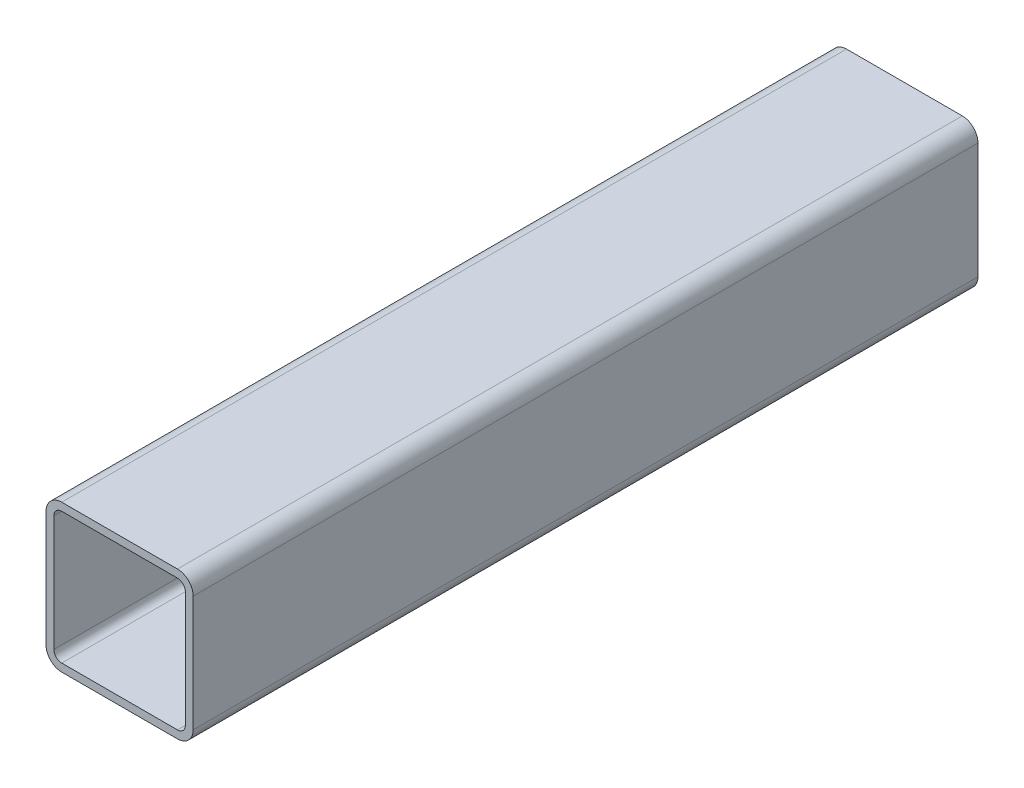
ISO-10303-21;
HEADER;
FILE_DESCRIPTION(('STEP AP214'),'2;1');
FILE_NAME('part.step','',(''),(''),'','','');
FILE_SCHEMA(('AUTOMOTIVE_DESIGN { 1 0 10303 214 1 1 1 1 }'));
ENDSEC;
DATA;
#1=APPLICATION_CONTEXT('core data for automotive mechanical design processes');
#2=APPLICATION_PROTOCOL_DEFINITION('international standard','automotive_design',2000,#1);
#3=PRODUCT_CONTEXT('',#1,'mechanical');
#4=PRODUCT('Part','Part','',(#3));
#5=PRODUCT_RELATED_PRODUCT_CATEGORY('part','',(#4));
#6=PRODUCT_DEFINITION_FORMATION('','',#4);
#7=PRODUCT_DEFINITION_CONTEXT('part definition',#1,'design');
#8=PRODUCT_DEFINITION('design','',#6,#7);
#9=PRODUCT_DEFINITION_SHAPE('','',#8);
#10=(LENGTH_UNIT() NAMED_UNIT(*) SI_UNIT(.MILLI.,.METRE.));
#11=(NAMED_UNIT(*) PLANE_ANGLE_UNIT() SI_UNIT($,.RADIAN.));
#12=(NAMED_UNIT(*) SI_UNIT($,.STERADIAN.) SOLID_ANGLE_UNIT());
#13=UNCERTAINTY_MEASURE_WITH_UNIT(LENGTH_MEASURE(1.E-05),#10,'distance_accuracy_value','');
#14=(GEOMETRIC_REPRESENTATION_CONTEXT(3) GLOBAL_UNCERTAINTY_ASSIGNED_CONTEXT((#13)) GLOBAL_UNIT_ASSIGNED_CONTEXT((#10,
#11,#12)) REPRESENTATION_CONTEXT('',''));
#15=CARTESIAN_POINT('',(0.,0.,0.));
#16=DIRECTION('',(0.,0.,1.));
#17=DIRECTION('',(1.,0.,0.));
#18=AXIS2_PLACEMENT_3D('',#15,#16,#17);
#19=CARTESIAN_POINT('',(23.5999999999996,273.2,790.));
#20=DIRECTION('',(0.,1.,0.));
#21=DIRECTION('',(-1.,0.,0.));
#22=AXIS2_PLACEMENT_3D('',#19,#20,#21);
#23=PLANE('',#22);
#24=DIRECTION('',(0.,0.,1.));
#25=VECTOR('',#24,1.);
#26=CARTESIAN_POINT('',(-23.6000000000003,273.2,790.));
#27=LINE('',#26,#25);
#28=CARTESIAN_POINT('',(-23.6000000000003,273.2,820.));
#29=VERTEX_POINT('',#28);
#30=CARTESIAN_POINT('',(-23.6000000000003,273.2,1140.));
#31=VERTEX_POINT('',#30);
#32=EDGE_CURVE('E155',#29,#31,#27,.T.);
#33=ORIENTED_EDGE('',*,*,#32,.T.);
#34=DIRECTION('',(1.,0.,0.));
#35=VECTOR('',#34,1.);
#36=CARTESIAN_POINT('',(670.,273.2,1140.));
#37=LINE('',#36,#35);
#38=CARTESIAN_POINT('',(23.5999999999996,273.2,1140.));
#39=VERTEX_POINT('',#38);
#40=EDGE_CURVE('E215',#39,#31,#37,.F.);
#41=ORIENTED_EDGE('',*,*,#40,.F.);
#42=DIRECTION('',(0.,0.,1.));
#43=VECTOR('',#42,1.);
#44=CARTESIAN_POINT('',(23.5999999999996,273.2,790.));
#45=LINE('',#44,#43);
#46=CARTESIAN_POINT('',(23.5999999999996,273.2,820.));
#47=VERTEX_POINT('',#46);
#48=EDGE_CURVE('E174',#39,#47,#45,.F.);
#49=ORIENTED_EDGE('',*,*,#48,.T.);
#50=DIRECTION('',(1.,0.,0.));
#51=VECTOR('',#50,1.);
#52=CARTESIAN_POINT('',(670.,273.2,820.));
#53=LINE('',#52,#51);
#54=EDGE_CURVE('E201',#29,#47,#53,.T.);
#55=ORIENTED_EDGE('',*,*,#54,.F.);
#56=EDGE_LOOP('',(#33,#41,#49,#55));
#57=FACE_BOUND('',#56,.T.);
#58=ADVANCED_FACE('F17',(#57),#23,.T.);
#59=CARTESIAN_POINT('',(23.5999999999996,276.4,790.));
#60=DIRECTION('',(0.,0.,1.));
#61=DIRECTION('',(1.,0.,0.));
#62=AXIS2_PLACEMENT_3D('',#59,#60,#61);
#63=CYLINDRICAL_SURFACE('',#62,3.19999999999998);
#64=CARTESIAN_POINT('',(23.5999999999996,276.4,820.));
#65=DIRECTION('',(0.,0.,1.));
#66=DIRECTION('',(1.,0.,0.));
#67=AXIS2_PLACEMENT_3D('',#64,#65,#66);
#68=CIRCLE('',#67,3.19999999999998);
#69=CARTESIAN_POINT('',(26.7999999999997,276.4,820.));
#70=VERTEX_POINT('',#69);
#71=EDGE_CURVE('E199',#47,#70,#68,.T.);
#72=ORIENTED_EDGE('',*,*,#71,.F.);
#73=ORIENTED_EDGE('',*,*,#48,.F.);
#74=CARTESIAN_POINT('',(23.5999999999996,276.4,1140.));
#75=DIRECTION('',(0.,0.,1.));
#76=DIRECTION('',(1.,0.,0.));
#77=AXIS2_PLACEMENT_3D('',#74,#75,#76);
#78=CIRCLE('',#77,3.19999999999998);
#79=CARTESIAN_POINT('',(26.7999999999997,276.4,1140.));
#80=VERTEX_POINT('',#79);
#81=EDGE_CURVE('E216',#80,#39,#78,.F.);
#82=ORIENTED_EDGE('',*,*,#81,.F.);
#83=DIRECTION('',(0.,0.,1.));
#84=VECTOR('',#83,1.);
#85=CARTESIAN_POINT('',(26.7999999999997,276.4,790.));
#86=LINE('',#85,#84);
#87=EDGE_CURVE('E172',#70,#80,#86,.T.);
#88=ORIENTED_EDGE('',*,*,#87,.F.);
#89=EDGE_LOOP('',(#72,#73,#82,#88));
#90=FACE_BOUND('',#89,.T.);
#91=ADVANCED_FACE('F226',(#90),#63,.F.);
#92=CARTESIAN_POINT('',(26.7999999999997,276.4,790.));
#93=DIRECTION('',(-1.,0.,0.));
#94=DIRECTION('',(0.,0.,1.));
#95=AXIS2_PLACEMENT_3D('',#92,#93,#94);
#96=PLANE('',#95);
#97=ORIENTED_EDGE('',*,*,#87,.T.);
#98=DIRECTION('',(0.,-1.,0.));
#99=VECTOR('',#98,1.);
#100=CARTESIAN_POINT('',(26.7999999999996,323.6,1140.));
#101=LINE('',#100,#99);
#102=CARTESIAN_POINT('',(26.7999999999996,323.6,1140.));
#103=VERTEX_POINT('',#102);
#104=EDGE_CURVE('E139',#103,#80,#101,.T.);
#105=ORIENTED_EDGE('',*,*,#104,.F.);
#106=DIRECTION('',(0.,0.,1.));
#107=VECTOR('',#106,1.);
#108=CARTESIAN_POINT('',(26.7999999999996,323.6,790.));
#109=LINE('',#108,#107);
#110=CARTESIAN_POINT('',(26.7999999999997,323.6,820.));
#111=VERTEX_POINT('',#110);
#112=EDGE_CURVE('E169',#103,#111,#109,.F.);
#113=ORIENTED_EDGE('',*,*,#112,.T.);
#114=DIRECTION('',(0.,1.,0.));
#115=VECTOR('',#114,1.);
#116=CARTESIAN_POINT('',(26.7999999999997,276.4,820.));
#117=LINE('',#116,#115);
#118=EDGE_CURVE('E198',#70,#111,#117,.T.);
#119=ORIENTED_EDGE('',*,*,#118,.F.);
#120=EDGE_LOOP('',(#97,#105,#113,#119));
#121=FACE_BOUND('',#120,.T.);
#122=ADVANCED_FACE('F428',(#121),#96,.T.);
#123=CARTESIAN_POINT('',(23.5999999999996,323.6,790.));
#124=DIRECTION('',(0.,0.,1.));
#125=DIRECTION('',(1.,0.,0.));
#126=AXIS2_PLACEMENT_3D('',#123,#124,#125);
#127=CYLINDRICAL_SURFACE('',#126,3.19999999999998);
#128=CARTESIAN_POINT('',(23.5999999999996,323.6,820.));
#129=DIRECTION('',(0.,0.,1.));
#130=DIRECTION('',(1.,0.,0.));
#131=AXIS2_PLACEMENT_3D('',#128,#129,#130);
#132=CIRCLE('',#131,3.19999999999998);
#133=CARTESIAN_POINT('',(23.5999999999996,326.8,820.));
#134=VERTEX_POINT('',#133);
#135=EDGE_CURVE('E196',#111,#134,#132,.T.);
#136=ORIENTED_EDGE('',*,*,#135,.F.);
#137=ORIENTED_EDGE('',*,*,#112,.F.);
#138=CARTESIAN_POINT('',(23.5999999999996,323.6,1140.));
#139=DIRECTION('',(0.,0.,1.));
#140=DIRECTION('',(1.,0.,0.));
#141=AXIS2_PLACEMENT_3D('',#138,#139,#140);
#142=CIRCLE('',#141,3.19999999999998);
#143=CARTESIAN_POINT('',(23.5999999999996,326.8,1140.));
#144=VERTEX_POINT('',#143);
#145=EDGE_CURVE('E137',#144,#103,#142,.F.);
#146=ORIENTED_EDGE('',*,*,#145,.F.);
#147=DIRECTION('',(0.,0.,1.));
#148=VECTOR('',#147,1.);
#149=CARTESIAN_POINT('',(23.5999999999996,326.8,790.));
#150=LINE('',#149,#148);
#151=EDGE_CURVE('E125',#134,#144,#150,.T.);
#152=ORIENTED_EDGE('',*,*,#151,.F.);
#153=EDGE_LOOP('',(#136,#137,#146,#152));
#154=FACE_BOUND('',#153,.T.);
#155=ADVANCED_FACE('F419',(#154),#127,.F.);
#156=CARTESIAN_POINT('',(-23.6000000000003,326.8,790.));
#157=DIRECTION('',(0.,-1.,0.));
#158=DIRECTION('',(1.,0.,0.));
#159=AXIS2_PLACEMENT_3D('',#156,#157,#158);
#160=PLANE('',#159);
#161=ORIENTED_EDGE('',*,*,#151,.T.);
#162=DIRECTION('',(1.,0.,0.));
#163=VECTOR('',#162,1.);
#164=CARTESIAN_POINT('',(670.,326.8,1140.));
#165=LINE('',#164,#163);
#166=CARTESIAN_POINT('',(-23.6000000000003,326.8,1140.));
#167=VERTEX_POINT('',#166);
#168=EDGE_CURVE('E131',#167,#144,#165,.T.);
#169=ORIENTED_EDGE('',*,*,#168,.F.);
#170=DIRECTION('',(0.,0.,1.));
#171=VECTOR('',#170,1.);
#172=CARTESIAN_POINT('',(-23.6000000000003,326.8,790.));
#173=LINE('',#172,#171);
#174=CARTESIAN_POINT('',(-23.6000000000003,326.8,820.));
#175=VERTEX_POINT('',#174);
#176=EDGE_CURVE('E118',#167,#175,#173,.F.);
#177=ORIENTED_EDGE('',*,*,#176,.T.);
#178=DIRECTION('',(1.,0.,0.));
#179=VECTOR('',#178,1.);
#180=CARTESIAN_POINT('',(670.,326.8,820.));
#181=LINE('',#180,#179);
#182=EDGE_CURVE('E195',#134,#175,#181,.F.);
#183=ORIENTED_EDGE('',*,*,#182,.F.);
#184=EDGE_LOOP('',(#161,#169,#177,#183));
#185=FACE_BOUND('',#184,.T.);
#186=ADVANCED_FACE('F135',(#185),#160,.T.);
#187=CARTESIAN_POINT('',(-23.6000000000003,323.6,790.));
#188=DIRECTION('',(0.,0.,1.));
#189=DIRECTION('',(1.,0.,0.));
#190=AXIS2_PLACEMENT_3D('',#187,#188,#189);
#191=CYLINDRICAL_SURFACE('',#190,3.19999999999993);
#192=CARTESIAN_POINT('',(-23.6000000000003,323.6,820.));
#193=DIRECTION('',(0.,0.,1.));
#194=DIRECTION('',(1.,0.,0.));
#195=AXIS2_PLACEMENT_3D('',#192,#193,#194);
#196=CIRCLE('',#195,3.19999999999993);
#197=CARTESIAN_POINT('',(-26.8000000000003,323.6,820.));
#198=VERTEX_POINT('',#197);
#199=EDGE_CURVE('E121',#175,#198,#196,.T.);
#200=ORIENTED_EDGE('',*,*,#199,.F.);
#201=ORIENTED_EDGE('',*,*,#176,.F.);
#202=CARTESIAN_POINT('',(-23.6000000000003,323.6,1140.));
#203=DIRECTION('',(0.,0.,1.));
#204=DIRECTION('',(1.,0.,0.));
#205=AXIS2_PLACEMENT_3D('',#202,#203,#204);
#206=CIRCLE('',#205,3.19999999999993);
#207=CARTESIAN_POINT('',(-26.8000000000003,323.6,1140.));
#208=VERTEX_POINT('',#207);
#209=EDGE_CURVE('E20',#208,#167,#206,.F.);
#210=ORIENTED_EDGE('',*,*,#209,.F.);
#211=DIRECTION('',(0.,0.,1.));
#212=VECTOR('',#211,1.);
#213=CARTESIAN_POINT('',(-26.8000000000003,323.6,790.));
#214=LINE('',#213,#212);
#215=EDGE_CURVE('E111',#198,#208,#214,.T.);
#216=ORIENTED_EDGE('',*,*,#215,.F.);
#217=EDGE_LOOP('',(#200,#201,#210,#216));
#218=FACE_BOUND('',#217,.T.);
#219=ADVANCED_FACE('F120',(#218),#191,.F.);
#220=CARTESIAN_POINT('',(-26.8000000000003,323.6,790.));
#221=DIRECTION('',(1.,0.,0.));
#222=DIRECTION('',(0.,1.,0.));
#223=AXIS2_PLACEMENT_3D('',#220,#221,#222);
#224=PLANE('',#223);
#225=ORIENTED_EDGE('',*,*,#215,.T.);
#226=DIRECTION('',(0.,-1.,0.));
#227=VECTOR('',#226,1.);
#228=CARTESIAN_POINT('',(-26.8000000000004,323.6,1140.));
#229=LINE('',#228,#227);
#230=CARTESIAN_POINT('',(-26.8000000000003,276.4,1140.));
#231=VERTEX_POINT('',#230);
#232=EDGE_CURVE('E134',#231,#208,#229,.F.);
#233=ORIENTED_EDGE('',*,*,#232,.F.);
#234=DIRECTION('',(0.,0.,1.));
#235=VECTOR('',#234,1.);
#236=CARTESIAN_POINT('',(-26.8000000000003,276.4,790.));
#237=LINE('',#236,#235);
#238=CARTESIAN_POINT('',(-26.8000000000003,276.4,820.));
#239=VERTEX_POINT('',#238);
#240=EDGE_CURVE('E162',#231,#239,#237,.F.);
#241=ORIENTED_EDGE('',*,*,#240,.T.);
#242=DIRECTION('',(0.,1.,0.));
#243=VECTOR('',#242,1.);
#244=CARTESIAN_POINT('',(-26.8000000000003,276.4,820.));
#245=LINE('',#244,#243);
#246=EDGE_CURVE('E193',#198,#239,#245,.F.);
#247=ORIENTED_EDGE('',*,*,#246,.F.);
#248=EDGE_LOOP('',(#225,#233,#241,#247));
#249=FACE_BOUND('',#248,.T.);
#250=ADVANCED_FACE('F232',(#249),#224,.T.);
#251=CARTESIAN_POINT('',(-23.6000000000003,276.4,790.));
#252=DIRECTION('',(0.,0.,1.));
#253=DIRECTION('',(1.,0.,0.));
#254=AXIS2_PLACEMENT_3D('',#251,#252,#253);
#255=CYLINDRICAL_SURFACE('',#254,3.19999999999998);
#256=CARTESIAN_POINT('',(-23.6000000000003,276.4,820.));
#257=DIRECTION('',(0.,0.,1.));
#258=DIRECTION('',(1.,0.,0.));
#259=AXIS2_PLACEMENT_3D('',#256,#257,#258);
#260=CIRCLE('',#259,3.19999999999998);
#261=EDGE_CURVE('E190',#239,#29,#260,.T.);
#262=ORIENTED_EDGE('',*,*,#261,.F.);
#263=ORIENTED_EDGE('',*,*,#240,.F.);
#264=CARTESIAN_POINT('',(-23.6000000000003,276.4,1140.));
#265=DIRECTION('',(0.,0.,1.));
#266=DIRECTION('',(1.,0.,0.));
#267=AXIS2_PLACEMENT_3D('',#264,#265,#266);
#268=CIRCLE('',#267,3.19999999999998);
#269=EDGE_CURVE('E213',#31,#231,#268,.F.);
#270=ORIENTED_EDGE('',*,*,#269,.F.);
#271=ORIENTED_EDGE('',*,*,#32,.F.);
#272=EDGE_LOOP('',(#262,#263,#270,#271));
#273=FACE_BOUND('',#272,.T.);
#274=ADVANCED_FACE('F234',(#273),#255,.F.);
#275=CARTESIAN_POINT('',(-23.6000000000003,330.,790.));
#276=DIRECTION('',(0.,-1.,0.));
#277=DIRECTION('',(1.,0.,0.));
#278=AXIS2_PLACEMENT_3D('',#275,#276,#277);
#279=PLANE('',#278);
#280=DIRECTION('',(0.,0.,1.));
#281=VECTOR('',#280,1.);
#282=CARTESIAN_POINT('',(-23.6000000000003,330.,790.));
#283=LINE('',#282,#281);
#284=CARTESIAN_POINT('',(-23.6000000000003,330.,1140.));
#285=VERTEX_POINT('',#284);
#286=CARTESIAN_POINT('',(-23.6000000000003,330.,820.));
#287=VERTEX_POINT('',#286);
#288=EDGE_CURVE('E144',#285,#287,#283,.F.);
#289=ORIENTED_EDGE('',*,*,#288,.F.);
#290=DIRECTION('',(1.,0.,0.));
#291=VECTOR('',#290,1.);
#292=CARTESIAN_POINT('',(670.,330.,1140.));
#293=LINE('',#292,#291);
#294=CARTESIAN_POINT('',(23.5999999999996,330.,1140.));
#295=VERTEX_POINT('',#294);
#296=EDGE_CURVE('E204',#295,#285,#293,.F.);
#297=ORIENTED_EDGE('',*,*,#296,.F.);
#298=DIRECTION('',(0.,0.,1.));
#299=VECTOR('',#298,1.);
#300=CARTESIAN_POINT('',(23.5999999999996,330.,790.));
#301=LINE('',#300,#299);
#302=CARTESIAN_POINT('',(23.5999999999996,330.,820.));
#303=VERTEX_POINT('',#302);
#304=EDGE_CURVE('E153',#303,#295,#301,.T.);
#305=ORIENTED_EDGE('',*,*,#304,.F.);
#306=DIRECTION('',(1.,0.,0.));
#307=VECTOR('',#306,1.);
#308=CARTESIAN_POINT('',(670.,330.,820.));
#309=LINE('',#308,#307);
#310=EDGE_CURVE('E185',#287,#303,#309,.T.);
#311=ORIENTED_EDGE('',*,*,#310,.F.);
#312=EDGE_LOOP('',(#289,#297,#305,#311));
#313=FACE_BOUND('',#312,.T.);
#314=ADVANCED_FACE('F301',(#313),#279,.F.);
#315=CARTESIAN_POINT('',(23.5999999999996,323.6,790.));
#316=DIRECTION('',(0.,0.,1.));
#317=DIRECTION('',(1.,0.,0.));
#318=AXIS2_PLACEMENT_3D('',#315,#316,#317);
#319=CYLINDRICAL_SURFACE('',#318,6.40000000000002);
#320=CARTESIAN_POINT('',(23.5999999999996,323.6,1140.));
#321=DIRECTION('',(0.,0.,1.));
#322=DIRECTION('',(1.,0.,0.));
#323=AXIS2_PLACEMENT_3D('',#320,#321,#322);
#324=CIRCLE('',#323,6.40000000000002);
#325=CARTESIAN_POINT('',(29.9999999999997,323.6,1140.));
#326=VERTEX_POINT('',#325);
#327=EDGE_CURVE('E205',#326,#295,#324,.T.);
#328=ORIENTED_EDGE('',*,*,#327,.F.);
#329=DIRECTION('',(0.,0.,1.));
#330=VECTOR('',#329,1.);
#331=CARTESIAN_POINT('',(29.9999999999997,323.6,790.));
#332=LINE('',#331,#330);
#333=CARTESIAN_POINT('',(29.9999999999997,323.6,820.));
#334=VERTEX_POINT('',#333);
#335=EDGE_CURVE('E150',#326,#334,#332,.F.);
#336=ORIENTED_EDGE('',*,*,#335,.T.);
#337=CARTESIAN_POINT('',(23.5999999999996,323.6,820.));
#338=DIRECTION('',(0.,0.,1.));
#339=DIRECTION('',(1.,0.,0.));
#340=AXIS2_PLACEMENT_3D('',#337,#338,#339);
#341=CIRCLE('',#340,6.40000000000002);
#342=EDGE_CURVE('E182',#303,#334,#341,.F.);
#343=ORIENTED_EDGE('',*,*,#342,.F.);
#344=ORIENTED_EDGE('',*,*,#304,.T.);
#345=EDGE_LOOP('',(#328,#336,#343,#344));
#346=FACE_BOUND('',#345,.T.);
#347=ADVANCED_FACE('F305',(#346),#319,.T.);
#348=CARTESIAN_POINT('',(29.9999999999997,276.4,790.));
#349=DIRECTION('',(-1.,0.,0.));
#350=DIRECTION('',(0.,0.,1.));
#351=AXIS2_PLACEMENT_3D('',#348,#349,#350);
#352=PLANE('',#351);
#353=ORIENTED_EDGE('',*,*,#335,.F.);
#354=DIRECTION('',(0.,-1.,0.));
#355=VECTOR('',#354,1.);
#356=CARTESIAN_POINT('',(29.9999999999997,323.6,1140.));
#357=LINE('',#356,#355);
#358=CARTESIAN_POINT('',(29.9999999999997,276.4,1140.));
#359=VERTEX_POINT('',#358);
#360=EDGE_CURVE('E208',#359,#326,#357,.F.);
#361=ORIENTED_EDGE('',*,*,#360,.F.);
#362=DIRECTION('',(0.,0.,1.));
#363=VECTOR('',#362,1.);
#364=CARTESIAN_POINT('',(29.9999999999996,276.4,790.));
#365=LINE('',#364,#363);
#366=CARTESIAN_POINT('',(29.9999999999997,276.4,820.));
#367=VERTEX_POINT('',#366);
#368=EDGE_CURVE('E148',#367,#359,#365,.T.);
#369=ORIENTED_EDGE('',*,*,#368,.F.);
#370=DIRECTION('',(0.,1.,0.));
#371=VECTOR('',#370,1.);
#372=CARTESIAN_POINT('',(29.9999999999997,276.4,820.));
#373=LINE('',#372,#371);
#374=EDGE_CURVE('E181',#334,#367,#373,.F.);
#375=ORIENTED_EDGE('',*,*,#374,.F.);
#376=EDGE_LOOP('',(#353,#361,#369,#375));
#377=FACE_BOUND('',#376,.T.);
#378=ADVANCED_FACE('F272',(#377),#352,.F.);
#379=CARTESIAN_POINT('',(23.5999999999996,276.4,790.));
#380=DIRECTION('',(0.,0.,1.));
#381=DIRECTION('',(1.,0.,0.));
#382=AXIS2_PLACEMENT_3D('',#379,#380,#381);
#383=CYLINDRICAL_SURFACE('',#382,6.40000000000002);
#384=CARTESIAN_POINT('',(23.5999999999996,276.4,1140.));
#385=DIRECTION('',(0.,0.,1.));
#386=DIRECTION('',(1.,0.,0.));
#387=AXIS2_PLACEMENT_3D('',#384,#385,#386);
#388=CIRCLE('',#387,6.40000000000002);
#389=CARTESIAN_POINT('',(23.5999999999996,270.,1140.));
#390=VERTEX_POINT('',#389);
#391=EDGE_CURVE('E209',#390,#359,#388,.T.);
#392=ORIENTED_EDGE('',*,*,#391,.F.);
#393=DIRECTION('',(0.,0.,1.));
#394=VECTOR('',#393,1.);
#395=CARTESIAN_POINT('',(23.5999999999996,270.,790.));
#396=LINE('',#395,#394);
#397=CARTESIAN_POINT('',(23.5999999999996,270.,820.));
#398=VERTEX_POINT('',#397);
#399=EDGE_CURVE('E145',#390,#398,#396,.F.);
#400=ORIENTED_EDGE('',*,*,#399,.T.);
#401=CARTESIAN_POINT('',(23.5999999999996,276.4,820.));
#402=DIRECTION('',(0.,0.,1.));
#403=DIRECTION('',(1.,0.,0.));
#404=AXIS2_PLACEMENT_3D('',#401,#402,#403);
#405=CIRCLE('',#404,6.40000000000002);
#406=EDGE_CURVE('E177',#367,#398,#405,.F.);
#407=ORIENTED_EDGE('',*,*,#406,.F.);
#408=ORIENTED_EDGE('',*,*,#368,.T.);
#409=EDGE_LOOP('',(#392,#400,#407,#408));
#410=FACE_BOUND('',#409,.T.);
#411=ADVANCED_FACE('F264',(#410),#383,.T.);
#412=CARTESIAN_POINT('',(23.5999999999996,270.,790.));
#413=DIRECTION('',(0.,1.,0.));
#414=DIRECTION('',(-1.,0.,0.));
#415=AXIS2_PLACEMENT_3D('',#412,#413,#414);
#416=PLANE('',#415);
#417=ORIENTED_EDGE('',*,*,#399,.F.);
#418=DIRECTION('',(1.,0.,0.));
#419=VECTOR('',#418,1.);
#420=CARTESIAN_POINT('',(670.,270.,1140.));
#421=LINE('',#420,#419);
#422=CARTESIAN_POINT('',(-23.6000000000003,270.,1140.));
#423=VERTEX_POINT('',#422);
#424=EDGE_CURVE('E212',#423,#390,#421,.T.);
#425=ORIENTED_EDGE('',*,*,#424,.F.);
#426=DIRECTION('',(0.,0.,1.));
#427=VECTOR('',#426,1.);
#428=CARTESIAN_POINT('',(-23.6000000000003,270.,790.));
#429=LINE('',#428,#427);
#430=CARTESIAN_POINT('',(-23.6000000000003,270.,820.));
#431=VERTEX_POINT('',#430);
#432=EDGE_CURVE('E158',#431,#423,#429,.T.);
#433=ORIENTED_EDGE('',*,*,#432,.F.);
#434=DIRECTION('',(1.,0.,0.));
#435=VECTOR('',#434,1.);
#436=CARTESIAN_POINT('',(670.,270.,820.));
#437=LINE('',#436,#435);
#438=EDGE_CURVE('E180',#398,#431,#437,.F.);
#439=ORIENTED_EDGE('',*,*,#438,.F.);
#440=EDGE_LOOP('',(#417,#425,#433,#439));
#441=FACE_BOUND('',#440,.T.);
#442=ADVANCED_FACE('F288',(#441),#416,.F.);
#443=CARTESIAN_POINT('',(-23.6000000000003,323.6,790.));
#444=DIRECTION('',(0.,0.,1.));
#445=DIRECTION('',(1.,0.,0.));
#446=AXIS2_PLACEMENT_3D('',#443,#444,#445);
#447=CYLINDRICAL_SURFACE('',#446,6.40000000000002);
#448=CARTESIAN_POINT('',(-23.6000000000003,323.6,1140.));
#449=DIRECTION('',(0.,0.,1.));
#450=DIRECTION('',(1.,0.,0.));
#451=AXIS2_PLACEMENT_3D('',#448,#449,#450);
#452=CIRCLE('',#451,6.40000000000002);
#453=CARTESIAN_POINT('',(-30.0000000000004,323.6,1140.));
#454=VERTEX_POINT('',#453);
#455=EDGE_CURVE('E161',#285,#454,#452,.T.);
#456=ORIENTED_EDGE('',*,*,#455,.F.);
#457=ORIENTED_EDGE('',*,*,#288,.T.);
#458=CARTESIAN_POINT('',(-23.6000000000003,323.6,820.));
#459=DIRECTION('',(0.,0.,1.));
#460=DIRECTION('',(1.,0.,0.));
#461=AXIS2_PLACEMENT_3D('',#458,#459,#460);
#462=CIRCLE('',#461,6.40000000000002);
#463=CARTESIAN_POINT('',(-30.0000000000004,323.6,820.));
#464=VERTEX_POINT('',#463);
#465=EDGE_CURVE('E186',#464,#287,#462,.F.);
#466=ORIENTED_EDGE('',*,*,#465,.F.);
#467=DIRECTION('',(0.,0.,-1.));
#468=VECTOR('',#467,1.);
#469=CARTESIAN_POINT('',(-30.0000000000004,323.6,790.));
#470=LINE('',#469,#468);
#471=EDGE_CURVE('E247',#464,#454,#470,.F.);
#472=ORIENTED_EDGE('',*,*,#471,.T.);
#473=EDGE_LOOP('',(#456,#457,#466,#472));
#474=FACE_BOUND('',#473,.T.);
#475=ADVANCED_FACE('F297',(#474),#447,.T.);
#476=CARTESIAN_POINT('',(670.,323.6,1140.));
#477=DIRECTION('',(0.,0.,1.));
#478=DIRECTION('',(0.,-1.,0.));
#479=AXIS2_PLACEMENT_3D('',#476,#477,#478);
#480=PLANE('',#479);
#481=ORIENTED_EDGE('',*,*,#455,.T.);
#482=DIRECTION('',(0.,1.,0.));
#483=VECTOR('',#482,1.);
#484=CARTESIAN_POINT('',(-30.0000000000004,323.6,1140.));
#485=LINE('',#484,#483);
#486=CARTESIAN_POINT('',(-30.0000000000004,276.4,1140.));
#487=VERTEX_POINT('',#486);
#488=EDGE_CURVE('E245',#454,#487,#485,.F.);
#489=ORIENTED_EDGE('',*,*,#488,.T.);
#490=CARTESIAN_POINT('',(-23.6000000000003,276.4,1140.));
#491=DIRECTION('',(0.,0.,1.));
#492=DIRECTION('',(1.,0.,0.));
#493=AXIS2_PLACEMENT_3D('',#490,#491,#492);
#494=CIRCLE('',#493,6.40000000000002);
#495=EDGE_CURVE('E160',#423,#487,#494,.F.);
#496=ORIENTED_EDGE('',*,*,#495,.F.);
#497=ORIENTED_EDGE('',*,*,#424,.T.);
#498=ORIENTED_EDGE('',*,*,#391,.T.);
#499=ORIENTED_EDGE('',*,*,#360,.T.);
#500=ORIENTED_EDGE('',*,*,#327,.T.);
#501=ORIENTED_EDGE('',*,*,#296,.T.);
#502=EDGE_LOOP('',(#481,#489,#496,#497,#498,#499,#500,#501));
#503=FACE_BOUND('',#502,.T.);
#504=ORIENTED_EDGE('',*,*,#40,.T.);
#505=ORIENTED_EDGE('',*,*,#269,.T.);
#506=ORIENTED_EDGE('',*,*,#232,.T.);
#507=ORIENTED_EDGE('',*,*,#209,.T.);
#508=ORIENTED_EDGE('',*,*,#168,.T.);
#509=ORIENTED_EDGE('',*,*,#145,.T.);
#510=ORIENTED_EDGE('',*,*,#104,.T.);
#511=ORIENTED_EDGE('',*,*,#81,.T.);
#512=EDGE_LOOP('',(#504,#505,#506,#507,#508,#509,#510,#511));
#513=FACE_BOUND('',#512,.T.);
#514=ADVANCED_FACE('F129',(#503,#513),#480,.T.);
#515=CARTESIAN_POINT('',(-23.6000000000003,276.4,790.));
#516=DIRECTION('',(0.,0.,1.));
#517=DIRECTION('',(1.,0.,0.));
#518=AXIS2_PLACEMENT_3D('',#515,#516,#517);
#519=CYLINDRICAL_SURFACE('',#518,6.40000000000002);
#520=ORIENTED_EDGE('',*,*,#495,.T.);
#521=DIRECTION('',(0.,0.,-1.));
#522=VECTOR('',#521,1.);
#523=CARTESIAN_POINT('',(-30.0000000000004,276.4,790.));
#524=LINE('',#523,#522);
#525=CARTESIAN_POINT('',(-30.0000000000004,276.4,820.));
#526=VERTEX_POINT('',#525);
#527=EDGE_CURVE('E26',#487,#526,#524,.T.);
#528=ORIENTED_EDGE('',*,*,#527,.T.);
#529=CARTESIAN_POINT('',(-23.6000000000003,276.4,820.));
#530=DIRECTION('',(0.,0.,1.));
#531=DIRECTION('',(1.,0.,0.));
#532=AXIS2_PLACEMENT_3D('',#529,#530,#531);
#533=CIRCLE('',#532,6.40000000000002);
#534=EDGE_CURVE('E34',#431,#526,#533,.F.);
#535=ORIENTED_EDGE('',*,*,#534,.F.);
#536=ORIENTED_EDGE('',*,*,#432,.T.);
#537=EDGE_LOOP('',(#520,#528,#535,#536));
#538=FACE_BOUND('',#537,.T.);
#539=ADVANCED_FACE('F291',(#538),#519,.T.);
#540=CARTESIAN_POINT('',(670.,276.4,820.));
#541=DIRECTION('',(0.,0.,-1.));
#542=DIRECTION('',(0.,1.,0.));
#543=AXIS2_PLACEMENT_3D('',#540,#541,#542);
#544=PLANE('',#543);
#545=ORIENTED_EDGE('',*,*,#406,.T.);
#546=ORIENTED_EDGE('',*,*,#438,.T.);
#547=ORIENTED_EDGE('',*,*,#534,.T.);
#548=DIRECTION('',(0.,1.,0.));
#549=VECTOR('',#548,1.);
#550=CARTESIAN_POINT('',(-30.0000000000004,323.6,820.));
#551=LINE('',#550,#549);
#552=EDGE_CURVE('E11',#526,#464,#551,.T.);
#553=ORIENTED_EDGE('',*,*,#552,.T.);
#554=ORIENTED_EDGE('',*,*,#465,.T.);
#555=ORIENTED_EDGE('',*,*,#310,.T.);
#556=ORIENTED_EDGE('',*,*,#342,.T.);
#557=ORIENTED_EDGE('',*,*,#374,.T.);
#558=EDGE_LOOP('',(#545,#546,#547,#553,#554,#555,#556,#557));
#559=FACE_BOUND('',#558,.T.);
#560=ORIENTED_EDGE('',*,*,#246,.T.);
#561=ORIENTED_EDGE('',*,*,#261,.T.);
#562=ORIENTED_EDGE('',*,*,#54,.T.);
#563=ORIENTED_EDGE('',*,*,#71,.T.);
#564=ORIENTED_EDGE('',*,*,#118,.T.);
#565=ORIENTED_EDGE('',*,*,#135,.T.);
#566=ORIENTED_EDGE('',*,*,#182,.T.);
#567=ORIENTED_EDGE('',*,*,#199,.T.);
#568=EDGE_LOOP('',(#560,#561,#562,#563,#564,#565,#566,#567));
#569=FACE_BOUND('',#568,.T.);
#570=ADVANCED_FACE('F236',(#559,#569),#544,.T.);
#571=CARTESIAN_POINT('',(-30.0000000000004,323.6,790.));
#572=DIRECTION('',(1.,0.,0.));
#573=DIRECTION('',(0.,0.,-1.));
#574=AXIS2_PLACEMENT_3D('',#571,#572,#573);
#575=PLANE('',#574);
#576=ORIENTED_EDGE('',*,*,#527,.F.);
#577=ORIENTED_EDGE('',*,*,#488,.F.);
#578=ORIENTED_EDGE('',*,*,#471,.F.);
#579=ORIENTED_EDGE('',*,*,#552,.F.);
#580=EDGE_LOOP('',(#576,#577,#578,#579));
#581=FACE_BOUND('',#580,.T.);
#582=ADVANCED_FACE('F295',(#581),#575,.F.);
#583=CLOSED_SHELL('',(#58,#91,#122,#155,#186,#219,#250,#274,#314,#347,#378,#411,#442,#475,#514,
#539,#570,#582));
#584=MANIFOLD_SOLID_BREP('B1',#583);
#585=ADVANCED_BREP_SHAPE_REPRESENTATION('',(#18,#584),#14);
#586=SHAPE_DEFINITION_REPRESENTATION(#9,#585);
ENDSEC;
END-ISO-10303-21;
